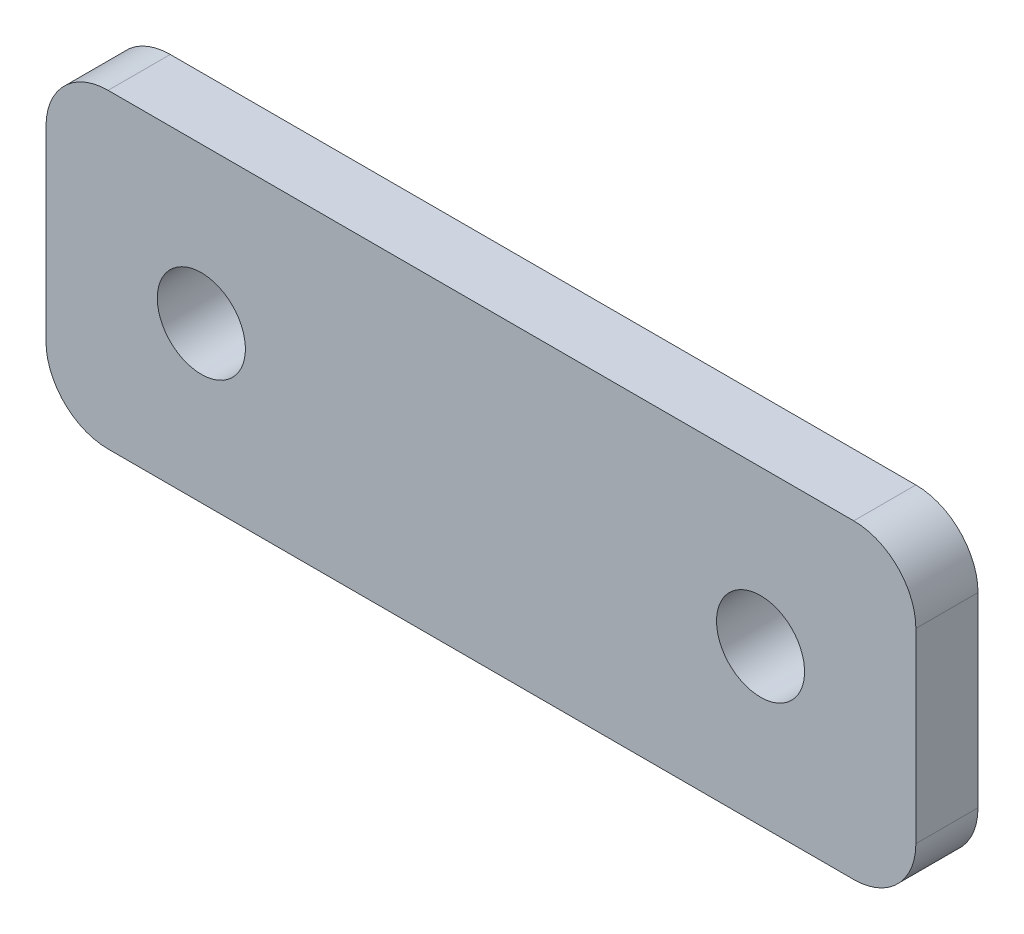
ISO-10303-21;
HEADER;
FILE_DESCRIPTION(('STEP AP214'),'2;1');
FILE_NAME('part.step','',(''),(''),'','','');
FILE_SCHEMA(('AUTOMOTIVE_DESIGN { 1 0 10303 214 1 1 1 1 }'));
ENDSEC;
DATA;
#1=APPLICATION_CONTEXT('core data for automotive mechanical design processes');
#2=APPLICATION_PROTOCOL_DEFINITION('international standard','automotive_design',2000,#1);
#3=PRODUCT_CONTEXT('',#1,'mechanical');
#4=PRODUCT('Part','Part','',(#3));
#5=PRODUCT_RELATED_PRODUCT_CATEGORY('part','',(#4));
#6=PRODUCT_DEFINITION_FORMATION('','',#4);
#7=PRODUCT_DEFINITION_CONTEXT('part definition',#1,'design');
#8=PRODUCT_DEFINITION('design','',#6,#7);
#9=PRODUCT_DEFINITION_SHAPE('','',#8);
#10=(LENGTH_UNIT() NAMED_UNIT(*) SI_UNIT(.MILLI.,.METRE.));
#11=(NAMED_UNIT(*) PLANE_ANGLE_UNIT() SI_UNIT($,.RADIAN.));
#12=(NAMED_UNIT(*) SI_UNIT($,.STERADIAN.) SOLID_ANGLE_UNIT());
#13=UNCERTAINTY_MEASURE_WITH_UNIT(LENGTH_MEASURE(1.E-05),#10,'distance_accuracy_value','');
#14=(GEOMETRIC_REPRESENTATION_CONTEXT(3) GLOBAL_UNCERTAINTY_ASSIGNED_CONTEXT((#13)) GLOBAL_UNIT_ASSIGNED_CONTEXT((#10,
#11,#12)) REPRESENTATION_CONTEXT('',''));
#15=CARTESIAN_POINT('',(0.,0.,0.));
#16=DIRECTION('',(0.,0.,1.));
#17=DIRECTION('',(1.,0.,0.));
#18=AXIS2_PLACEMENT_3D('',#15,#16,#17);
#19=CARTESIAN_POINT('',(22.225,7.9375,3.175));
#20=DIRECTION('',(-1.,0.,0.));
#21=DIRECTION('',(0.,0.,1.));
#22=AXIS2_PLACEMENT_3D('',#19,#20,#21);
#23=PLANE('',#22);
#24=DIRECTION('',(0.,1.,0.));
#25=VECTOR('',#24,1.);
#26=CARTESIAN_POINT('',(22.225,7.9375,3.175));
#27=LINE('',#26,#25);
#28=CARTESIAN_POINT('',(22.225,-4.7625,3.175));
#29=VERTEX_POINT('',#28);
#30=CARTESIAN_POINT('',(22.225,4.7625,3.175));
#31=VERTEX_POINT('',#30);
#32=EDGE_CURVE('E136',#29,#31,#27,.T.);
#33=ORIENTED_EDGE('',*,*,#32,.F.);
#34=DIRECTION('',(0.,0.,-1.));
#35=VECTOR('',#34,1.);
#36=CARTESIAN_POINT('',(22.225,-4.7625,3.175));
#37=LINE('',#36,#35);
#38=CARTESIAN_POINT('',(22.225,-4.7625,0.));
#39=VERTEX_POINT('',#38);
#40=EDGE_CURVE('E11',#29,#39,#37,.T.);
#41=ORIENTED_EDGE('',*,*,#40,.T.);
#42=DIRECTION('',(0.,1.,0.));
#43=VECTOR('',#42,1.);
#44=CARTESIAN_POINT('',(22.225,7.9375,0.));
#45=LINE('',#44,#43);
#46=CARTESIAN_POINT('',(22.225,4.7625,0.));
#47=VERTEX_POINT('',#46);
#48=EDGE_CURVE('E138',#39,#47,#45,.T.);
#49=ORIENTED_EDGE('',*,*,#48,.T.);
#50=DIRECTION('',(0.,0.,-1.));
#51=VECTOR('',#50,1.);
#52=CARTESIAN_POINT('',(22.225,4.7625,3.175));
#53=LINE('',#52,#51);
#54=EDGE_CURVE('E49',#47,#31,#53,.F.);
#55=ORIENTED_EDGE('',*,*,#54,.T.);
#56=EDGE_LOOP('',(#33,#41,#49,#55));
#57=FACE_BOUND('',#56,.T.);
#58=ADVANCED_FACE('F41',(#57),#23,.F.);
#59=CARTESIAN_POINT('',(-22.225,7.9375,3.175));
#60=DIRECTION('',(0.,-1.,0.));
#61=DIRECTION('',(0.,0.,-1.));
#62=AXIS2_PLACEMENT_3D('',#59,#60,#61);
#63=PLANE('',#62);
#64=DIRECTION('',(-1.,0.,0.));
#65=VECTOR('',#64,1.);
#66=CARTESIAN_POINT('',(-22.225,7.9375,0.));
#67=LINE('',#66,#65);
#68=CARTESIAN_POINT('',(19.05,7.9375,0.));
#69=VERTEX_POINT('',#68);
#70=CARTESIAN_POINT('',(-19.05,7.9375,0.));
#71=VERTEX_POINT('',#70);
#72=EDGE_CURVE('E134',#69,#71,#67,.T.);
#73=ORIENTED_EDGE('',*,*,#72,.T.);
#74=DIRECTION('',(0.,0.,-1.));
#75=VECTOR('',#74,1.);
#76=CARTESIAN_POINT('',(-19.05,7.9375,3.175));
#77=LINE('',#76,#75);
#78=CARTESIAN_POINT('',(-19.05,7.9375,3.175));
#79=VERTEX_POINT('',#78);
#80=EDGE_CURVE('E113',#71,#79,#77,.F.);
#81=ORIENTED_EDGE('',*,*,#80,.T.);
#82=DIRECTION('',(-1.,0.,0.));
#83=VECTOR('',#82,1.);
#84=CARTESIAN_POINT('',(-22.225,7.9375,3.175));
#85=LINE('',#84,#83);
#86=CARTESIAN_POINT('',(19.05,7.9375,3.175));
#87=VERTEX_POINT('',#86);
#88=EDGE_CURVE('E174',#87,#79,#85,.T.);
#89=ORIENTED_EDGE('',*,*,#88,.F.);
#90=DIRECTION('',(0.,0.,-1.));
#91=VECTOR('',#90,1.);
#92=CARTESIAN_POINT('',(19.05,7.9375,3.175));
#93=LINE('',#92,#91);
#94=EDGE_CURVE('E118',#87,#69,#93,.T.);
#95=ORIENTED_EDGE('',*,*,#94,.T.);
#96=EDGE_LOOP('',(#73,#81,#89,#95));
#97=FACE_BOUND('',#96,.T.);
#98=ADVANCED_FACE('F178',(#97),#63,.F.);
#99=CARTESIAN_POINT('',(-22.225,7.9375,3.175));
#100=DIRECTION('',(1.,0.,0.));
#101=DIRECTION('',(0.,1.,0.));
#102=AXIS2_PLACEMENT_3D('',#99,#100,#101);
#103=PLANE('',#102);
#104=DIRECTION('',(0.,-1.,0.));
#105=VECTOR('',#104,1.);
#106=CARTESIAN_POINT('',(-22.225,7.9375,3.175));
#107=LINE('',#106,#105);
#108=CARTESIAN_POINT('',(-22.225,4.7625,3.175));
#109=VERTEX_POINT('',#108);
#110=CARTESIAN_POINT('',(-22.225,-4.7625,3.175));
#111=VERTEX_POINT('',#110);
#112=EDGE_CURVE('E127',#109,#111,#107,.T.);
#113=ORIENTED_EDGE('',*,*,#112,.F.);
#114=DIRECTION('',(0.,0.,-1.));
#115=VECTOR('',#114,1.);
#116=CARTESIAN_POINT('',(-22.225,4.7625,3.175));
#117=LINE('',#116,#115);
#118=CARTESIAN_POINT('',(-22.225,4.7625,0.));
#119=VERTEX_POINT('',#118);
#120=EDGE_CURVE('E112',#109,#119,#117,.T.);
#121=ORIENTED_EDGE('',*,*,#120,.T.);
#122=DIRECTION('',(0.,-1.,0.));
#123=VECTOR('',#122,1.);
#124=CARTESIAN_POINT('',(-22.225,7.9375,0.));
#125=LINE('',#124,#123);
#126=CARTESIAN_POINT('',(-22.225,-4.7625,0.));
#127=VERTEX_POINT('',#126);
#128=EDGE_CURVE('E125',#119,#127,#125,.T.);
#129=ORIENTED_EDGE('',*,*,#128,.T.);
#130=DIRECTION('',(0.,0.,-1.));
#131=VECTOR('',#130,1.);
#132=CARTESIAN_POINT('',(-22.225,-4.7625,3.175));
#133=LINE('',#132,#131);
#134=EDGE_CURVE('E129',#127,#111,#133,.F.);
#135=ORIENTED_EDGE('',*,*,#134,.T.);
#136=EDGE_LOOP('',(#113,#121,#129,#135));
#137=FACE_BOUND('',#136,.T.);
#138=ADVANCED_FACE('F124',(#137),#103,.F.);
#139=CARTESIAN_POINT('',(-22.225,-7.9375,3.175));
#140=DIRECTION('',(0.,1.,0.));
#141=DIRECTION('',(0.,0.,1.));
#142=AXIS2_PLACEMENT_3D('',#139,#140,#141);
#143=PLANE('',#142);
#144=DIRECTION('',(1.,0.,0.));
#145=VECTOR('',#144,1.);
#146=CARTESIAN_POINT('',(-22.225,-7.9375,3.175));
#147=LINE('',#146,#145);
#148=CARTESIAN_POINT('',(-19.05,-7.9375,3.175));
#149=VERTEX_POINT('',#148);
#150=CARTESIAN_POINT('',(19.05,-7.9375,3.175));
#151=VERTEX_POINT('',#150);
#152=EDGE_CURVE('E142',#149,#151,#147,.T.);
#153=ORIENTED_EDGE('',*,*,#152,.F.);
#154=DIRECTION('',(0.,0.,-1.));
#155=VECTOR('',#154,1.);
#156=CARTESIAN_POINT('',(-19.05,-7.9375,3.175));
#157=LINE('',#156,#155);
#158=CARTESIAN_POINT('',(-19.05,-7.9375,0.));
#159=VERTEX_POINT('',#158);
#160=EDGE_CURVE('E159',#149,#159,#157,.T.);
#161=ORIENTED_EDGE('',*,*,#160,.T.);
#162=DIRECTION('',(1.,0.,0.));
#163=VECTOR('',#162,1.);
#164=CARTESIAN_POINT('',(-22.225,-7.9375,0.));
#165=LINE('',#164,#163);
#166=CARTESIAN_POINT('',(19.05,-7.9375,0.));
#167=VERTEX_POINT('',#166);
#168=EDGE_CURVE('E133',#159,#167,#165,.T.);
#169=ORIENTED_EDGE('',*,*,#168,.T.);
#170=DIRECTION('',(0.,0.,-1.));
#171=VECTOR('',#170,1.);
#172=CARTESIAN_POINT('',(19.05,-7.9375,3.175));
#173=LINE('',#172,#171);
#174=EDGE_CURVE('E56',#167,#151,#173,.F.);
#175=ORIENTED_EDGE('',*,*,#174,.T.);
#176=EDGE_LOOP('',(#153,#161,#169,#175));
#177=FACE_BOUND('',#176,.T.);
#178=ADVANCED_FACE('F277',(#177),#143,.F.);
#179=CARTESIAN_POINT('',(0.,0.,3.175));
#180=DIRECTION('',(0.,0.,1.));
#181=DIRECTION('',(1.,0.,0.));
#182=AXIS2_PLACEMENT_3D('',#179,#180,#181);
#183=PLANE('',#182);
#184=CARTESIAN_POINT('',(14.2875,0.,3.175));
#185=DIRECTION('',(0.,0.,-1.));
#186=DIRECTION('',(-1.,0.,0.));
#187=AXIS2_PLACEMENT_3D('',#184,#185,#186);
#188=CIRCLE('',#187,2.25);
#189=CARTESIAN_POINT('',(12.0375,0.,3.175));
#190=VERTEX_POINT('',#189);
#191=EDGE_CURVE('E189',#190,#190,#188,.T.);
#192=ORIENTED_EDGE('',*,*,#191,.T.);
#193=EDGE_LOOP('',(#192));
#194=FACE_BOUND('',#193,.T.);
#195=CARTESIAN_POINT('',(-14.2875,0.,3.175));
#196=DIRECTION('',(0.,0.,-1.));
#197=DIRECTION('',(-1.,0.,0.));
#198=AXIS2_PLACEMENT_3D('',#195,#196,#197);
#199=CIRCLE('',#198,2.25);
#200=CARTESIAN_POINT('',(-16.5375,0.,3.175));
#201=VERTEX_POINT('',#200);
#202=EDGE_CURVE('E179',#201,#201,#199,.T.);
#203=ORIENTED_EDGE('',*,*,#202,.T.);
#204=EDGE_LOOP('',(#203));
#205=FACE_BOUND('',#204,.T.);
#206=ORIENTED_EDGE('',*,*,#88,.T.);
#207=CARTESIAN_POINT('',(-19.05,4.7625,3.175));
#208=DIRECTION('',(0.,0.,1.));
#209=DIRECTION('',(1.,0.,0.));
#210=AXIS2_PLACEMENT_3D('',#207,#208,#209);
#211=CIRCLE('',#210,3.175);
#212=EDGE_CURVE('E156',#79,#109,#211,.T.);
#213=ORIENTED_EDGE('',*,*,#212,.T.);
#214=ORIENTED_EDGE('',*,*,#112,.T.);
#215=CARTESIAN_POINT('',(-19.05,-4.7625,3.175));
#216=DIRECTION('',(0.,0.,1.));
#217=DIRECTION('',(1.,0.,0.));
#218=AXIS2_PLACEMENT_3D('',#215,#216,#217);
#219=CIRCLE('',#218,3.175);
#220=EDGE_CURVE('E63',#111,#149,#219,.T.);
#221=ORIENTED_EDGE('',*,*,#220,.T.);
#222=ORIENTED_EDGE('',*,*,#152,.T.);
#223=CARTESIAN_POINT('',(19.05,-4.7625,3.175));
#224=DIRECTION('',(0.,0.,1.));
#225=DIRECTION('',(1.,0.,0.));
#226=AXIS2_PLACEMENT_3D('',#223,#224,#225);
#227=CIRCLE('',#226,3.175);
#228=EDGE_CURVE('E153',#151,#29,#227,.T.);
#229=ORIENTED_EDGE('',*,*,#228,.T.);
#230=ORIENTED_EDGE('',*,*,#32,.T.);
#231=CARTESIAN_POINT('',(19.05,4.7625,3.175));
#232=DIRECTION('',(0.,0.,1.));
#233=DIRECTION('',(1.,0.,0.));
#234=AXIS2_PLACEMENT_3D('',#231,#232,#233);
#235=CIRCLE('',#234,3.175);
#236=EDGE_CURVE('E151',#31,#87,#235,.T.);
#237=ORIENTED_EDGE('',*,*,#236,.T.);
#238=EDGE_LOOP('',(#206,#213,#214,#221,#222,#229,#230,#237));
#239=FACE_BOUND('',#238,.T.);
#240=ADVANCED_FACE('F171',(#194,#205,#239),#183,.T.);
#241=CARTESIAN_POINT('',(0.,0.,0.));
#242=DIRECTION('',(0.,0.,1.));
#243=DIRECTION('',(1.,0.,0.));
#244=AXIS2_PLACEMENT_3D('',#241,#242,#243);
#245=PLANE('',#244);
#246=CARTESIAN_POINT('',(14.2875,0.,0.));
#247=DIRECTION('',(0.,0.,-1.));
#248=DIRECTION('',(-1.,0.,0.));
#249=AXIS2_PLACEMENT_3D('',#246,#247,#248);
#250=CIRCLE('',#249,2.24999999999999);
#251=CARTESIAN_POINT('',(12.0375,0.,0.));
#252=VERTEX_POINT('',#251);
#253=EDGE_CURVE('E192',#252,#252,#250,.T.);
#254=ORIENTED_EDGE('',*,*,#253,.F.);
#255=EDGE_LOOP('',(#254));
#256=FACE_BOUND('',#255,.T.);
#257=CARTESIAN_POINT('',(-14.2875,0.,0.));
#258=DIRECTION('',(0.,0.,-1.));
#259=DIRECTION('',(-1.,0.,0.));
#260=AXIS2_PLACEMENT_3D('',#257,#258,#259);
#261=CIRCLE('',#260,2.24999999999999);
#262=CARTESIAN_POINT('',(-16.5375,0.,0.));
#263=VERTEX_POINT('',#262);
#264=EDGE_CURVE('E181',#263,#263,#261,.T.);
#265=ORIENTED_EDGE('',*,*,#264,.F.);
#266=EDGE_LOOP('',(#265));
#267=FACE_BOUND('',#266,.T.);
#268=ORIENTED_EDGE('',*,*,#128,.F.);
#269=CARTESIAN_POINT('',(-19.05,4.7625,0.));
#270=DIRECTION('',(0.,0.,1.));
#271=DIRECTION('',(1.,0.,0.));
#272=AXIS2_PLACEMENT_3D('',#269,#270,#271);
#273=CIRCLE('',#272,3.175);
#274=EDGE_CURVE('E108',#119,#71,#273,.F.);
#275=ORIENTED_EDGE('',*,*,#274,.T.);
#276=ORIENTED_EDGE('',*,*,#72,.F.);
#277=CARTESIAN_POINT('',(19.05,4.7625,0.));
#278=DIRECTION('',(0.,0.,1.));
#279=DIRECTION('',(1.,0.,0.));
#280=AXIS2_PLACEMENT_3D('',#277,#278,#279);
#281=CIRCLE('',#280,3.175);
#282=EDGE_CURVE('E128',#69,#47,#281,.F.);
#283=ORIENTED_EDGE('',*,*,#282,.T.);
#284=ORIENTED_EDGE('',*,*,#48,.F.);
#285=CARTESIAN_POINT('',(19.05,-4.7625,0.));
#286=DIRECTION('',(0.,0.,1.));
#287=DIRECTION('',(1.,0.,0.));
#288=AXIS2_PLACEMENT_3D('',#285,#286,#287);
#289=CIRCLE('',#288,3.175);
#290=EDGE_CURVE('E145',#39,#167,#289,.F.);
#291=ORIENTED_EDGE('',*,*,#290,.T.);
#292=ORIENTED_EDGE('',*,*,#168,.F.);
#293=CARTESIAN_POINT('',(-19.05,-4.7625,0.));
#294=DIRECTION('',(0.,0.,1.));
#295=DIRECTION('',(1.,0.,0.));
#296=AXIS2_PLACEMENT_3D('',#293,#294,#295);
#297=CIRCLE('',#296,3.175);
#298=EDGE_CURVE('E119',#159,#127,#297,.F.);
#299=ORIENTED_EDGE('',*,*,#298,.T.);
#300=EDGE_LOOP('',(#268,#275,#276,#283,#284,#291,#292,#299));
#301=FACE_BOUND('',#300,.T.);
#302=ADVANCED_FACE('F131',(#256,#267,#301),#245,.F.);
#303=CARTESIAN_POINT('',(-14.2875,0.,0.));
#304=DIRECTION('',(0.,0.,-1.));
#305=DIRECTION('',(-1.,0.,0.));
#306=AXIS2_PLACEMENT_3D('',#303,#304,#305);
#307=CYLINDRICAL_SURFACE('',#306,2.24999999999999);
#308=ORIENTED_EDGE('',*,*,#202,.F.);
#309=EDGE_LOOP('',(#308));
#310=FACE_BOUND('',#309,.T.);
#311=ORIENTED_EDGE('',*,*,#264,.T.);
#312=EDGE_LOOP('',(#311));
#313=FACE_BOUND('',#312,.T.);
#314=ADVANCED_FACE('F200',(#310,#313),#307,.F.);
#315=CARTESIAN_POINT('',(14.2875,0.,0.));
#316=DIRECTION('',(0.,0.,-1.));
#317=DIRECTION('',(-1.,0.,0.));
#318=AXIS2_PLACEMENT_3D('',#315,#316,#317);
#319=CYLINDRICAL_SURFACE('',#318,2.25);
#320=ORIENTED_EDGE('',*,*,#191,.F.);
#321=EDGE_LOOP('',(#320));
#322=FACE_BOUND('',#321,.T.);
#323=ORIENTED_EDGE('',*,*,#253,.T.);
#324=EDGE_LOOP('',(#323));
#325=FACE_BOUND('',#324,.T.);
#326=ADVANCED_FACE('F196',(#322,#325),#319,.F.);
#327=CARTESIAN_POINT('',(-19.05,4.7625,3.175));
#328=DIRECTION('',(0.,0.,-1.));
#329=DIRECTION('',(-1.,0.,0.));
#330=AXIS2_PLACEMENT_3D('',#327,#328,#329);
#331=CYLINDRICAL_SURFACE('',#330,3.175);
#332=ORIENTED_EDGE('',*,*,#212,.F.);
#333=ORIENTED_EDGE('',*,*,#80,.F.);
#334=ORIENTED_EDGE('',*,*,#274,.F.);
#335=ORIENTED_EDGE('',*,*,#120,.F.);
#336=EDGE_LOOP('',(#332,#333,#334,#335));
#337=FACE_BOUND('',#336,.T.);
#338=ADVANCED_FACE('F111',(#337),#331,.T.);
#339=CARTESIAN_POINT('',(-19.05,-4.7625,3.175));
#340=DIRECTION('',(0.,0.,-1.));
#341=DIRECTION('',(-1.,0.,0.));
#342=AXIS2_PLACEMENT_3D('',#339,#340,#341);
#343=CYLINDRICAL_SURFACE('',#342,3.175);
#344=ORIENTED_EDGE('',*,*,#220,.F.);
#345=ORIENTED_EDGE('',*,*,#134,.F.);
#346=ORIENTED_EDGE('',*,*,#298,.F.);
#347=ORIENTED_EDGE('',*,*,#160,.F.);
#348=EDGE_LOOP('',(#344,#345,#346,#347));
#349=FACE_BOUND('',#348,.T.);
#350=ADVANCED_FACE('F224',(#349),#343,.T.);
#351=CARTESIAN_POINT('',(19.05,-4.7625,3.175));
#352=DIRECTION('',(0.,0.,-1.));
#353=DIRECTION('',(-1.,0.,0.));
#354=AXIS2_PLACEMENT_3D('',#351,#352,#353);
#355=CYLINDRICAL_SURFACE('',#354,3.175);
#356=ORIENTED_EDGE('',*,*,#228,.F.);
#357=ORIENTED_EDGE('',*,*,#174,.F.);
#358=ORIENTED_EDGE('',*,*,#290,.F.);
#359=ORIENTED_EDGE('',*,*,#40,.F.);
#360=EDGE_LOOP('',(#356,#357,#358,#359));
#361=FACE_BOUND('',#360,.T.);
#362=ADVANCED_FACE('F226',(#361),#355,.T.);
#363=CARTESIAN_POINT('',(19.05,4.7625,3.175));
#364=DIRECTION('',(0.,0.,-1.));
#365=DIRECTION('',(-1.,0.,0.));
#366=AXIS2_PLACEMENT_3D('',#363,#364,#365);
#367=CYLINDRICAL_SURFACE('',#366,3.175);
#368=ORIENTED_EDGE('',*,*,#236,.F.);
#369=ORIENTED_EDGE('',*,*,#54,.F.);
#370=ORIENTED_EDGE('',*,*,#282,.F.);
#371=ORIENTED_EDGE('',*,*,#94,.F.);
#372=EDGE_LOOP('',(#368,#369,#370,#371));
#373=FACE_BOUND('',#372,.T.);
#374=ADVANCED_FACE('F43',(#373),#367,.T.);
#375=CLOSED_SHELL('',(#58,#98,#138,#178,#240,#302,#314,#326,#338,#350,#362,#374));
#376=MANIFOLD_SOLID_BREP('B2',#375);
#377=ADVANCED_BREP_SHAPE_REPRESENTATION('',(#18,#376),#14);
#378=SHAPE_DEFINITION_REPRESENTATION(#9,#377);
ENDSEC;
END-ISO-10303-21;
